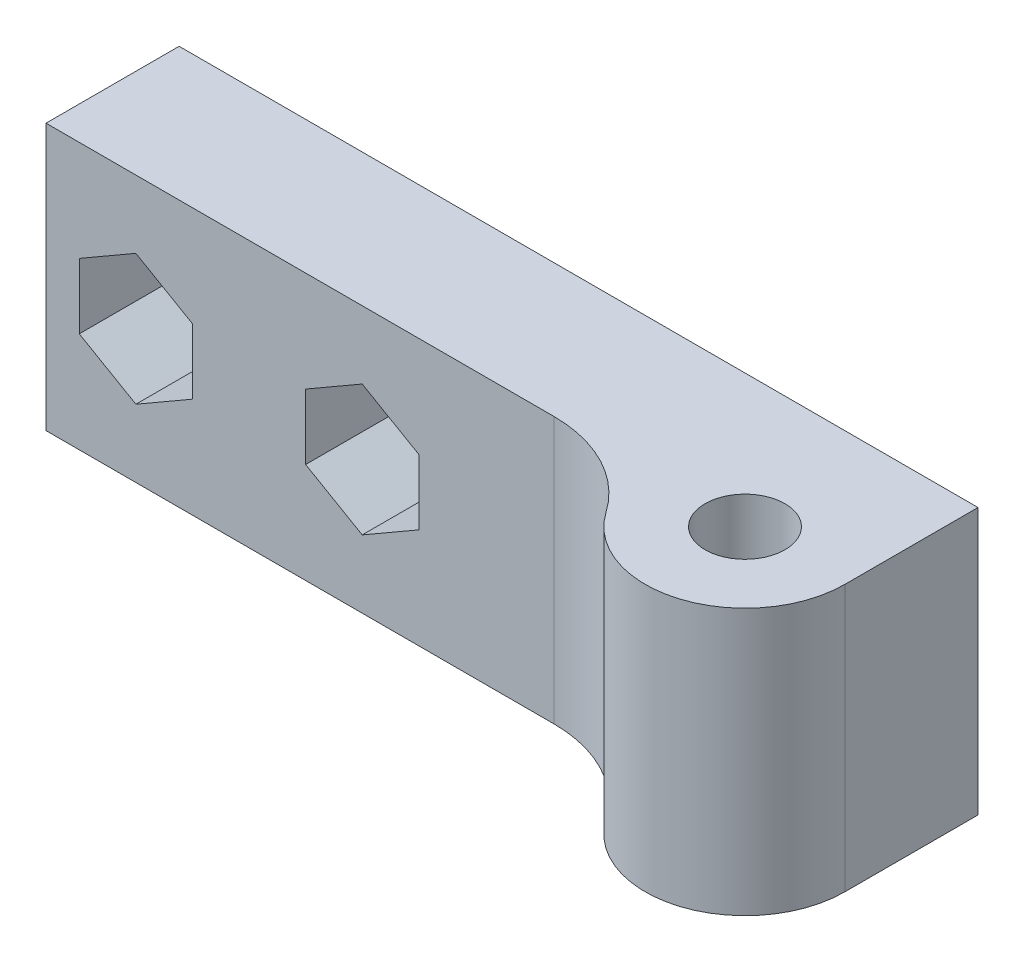
ISO-10303-21;
HEADER;
FILE_DESCRIPTION(('STEP AP214'),'2;1');
FILE_NAME('part.step','',(''),(''),'','','');
FILE_SCHEMA(('AUTOMOTIVE_DESIGN { 1 0 10303 214 1 1 1 1 }'));
ENDSEC;
DATA;
#1=APPLICATION_CONTEXT('core data for automotive mechanical design processes');
#2=APPLICATION_PROTOCOL_DEFINITION('international standard','automotive_design',2000,#1);
#3=PRODUCT_CONTEXT('',#1,'mechanical');
#4=PRODUCT('Part','Part','',(#3));
#5=PRODUCT_RELATED_PRODUCT_CATEGORY('part','',(#4));
#6=PRODUCT_DEFINITION_FORMATION('','',#4);
#7=PRODUCT_DEFINITION_CONTEXT('part definition',#1,'design');
#8=PRODUCT_DEFINITION('design','',#6,#7);
#9=PRODUCT_DEFINITION_SHAPE('','',#8);
#10=(LENGTH_UNIT() NAMED_UNIT(*) SI_UNIT(.MILLI.,.METRE.));
#11=(NAMED_UNIT(*) PLANE_ANGLE_UNIT() SI_UNIT($,.RADIAN.));
#12=(NAMED_UNIT(*) SI_UNIT($,.STERADIAN.) SOLID_ANGLE_UNIT());
#13=UNCERTAINTY_MEASURE_WITH_UNIT(LENGTH_MEASURE(1.E-05),#10,'distance_accuracy_value','');
#14=(GEOMETRIC_REPRESENTATION_CONTEXT(3) GLOBAL_UNCERTAINTY_ASSIGNED_CONTEXT((#13)) GLOBAL_UNIT_ASSIGNED_CONTEXT((#10,
#11,#12)) REPRESENTATION_CONTEXT('',''));
#15=CARTESIAN_POINT('',(0.,0.,0.));
#16=DIRECTION('',(0.,0.,1.));
#17=DIRECTION('',(1.,0.,0.));
#18=AXIS2_PLACEMENT_3D('',#15,#16,#17);
#19=CARTESIAN_POINT('',(-30.,0.,10.));
#20=DIRECTION('',(1.,0.,0.));
#21=DIRECTION('',(0.,1.,0.));
#22=AXIS2_PLACEMENT_3D('',#19,#20,#21);
#23=PLANE('',#22);
#24=DIRECTION('',(0.,-1.,0.));
#25=VECTOR('',#24,1.);
#26=CARTESIAN_POINT('',(-30.,0.,0.));
#27=LINE('',#26,#25);
#28=CARTESIAN_POINT('',(-30.,0.,0.));
#29=VERTEX_POINT('',#28);
#30=CARTESIAN_POINT('',(-30.,-20.,0.));
#31=VERTEX_POINT('',#30);
#32=EDGE_CURVE('E262',#29,#31,#27,.T.);
#33=ORIENTED_EDGE('',*,*,#32,.T.);
#34=DIRECTION('',(0.,0.,-1.));
#35=VECTOR('',#34,1.);
#36=CARTESIAN_POINT('',(-30.,-20.,10.));
#37=LINE('',#36,#35);
#38=CARTESIAN_POINT('',(-30.,-20.,10.));
#39=VERTEX_POINT('',#38);
#40=EDGE_CURVE('E300',#39,#31,#37,.T.);
#41=ORIENTED_EDGE('',*,*,#40,.F.);
#42=DIRECTION('',(0.,-1.,0.));
#43=VECTOR('',#42,1.);
#44=CARTESIAN_POINT('',(-30.,0.,10.));
#45=LINE('',#44,#43);
#46=CARTESIAN_POINT('',(-30.,0.,10.));
#47=VERTEX_POINT('',#46);
#48=EDGE_CURVE('E273',#47,#39,#45,.T.);
#49=ORIENTED_EDGE('',*,*,#48,.F.);
#50=DIRECTION('',(0.,0.,-1.));
#51=VECTOR('',#50,1.);
#52=CARTESIAN_POINT('',(-30.,0.,10.));
#53=LINE('',#52,#51);
#54=EDGE_CURVE('E284',#47,#29,#53,.T.);
#55=ORIENTED_EDGE('',*,*,#54,.T.);
#56=EDGE_LOOP('',(#33,#41,#49,#55));
#57=FACE_BOUND('',#56,.T.);
#58=ADVANCED_FACE('F33',(#57),#23,.F.);
#59=CARTESIAN_POINT('',(-30.,-20.,10.));
#60=DIRECTION('',(0.,1.,0.));
#61=DIRECTION('',(-1.,0.,0.));
#62=AXIS2_PLACEMENT_3D('',#59,#60,#61);
#63=PLANE('',#62);
#64=CARTESIAN_POINT('',(22.5,-20.,10.));
#65=DIRECTION('',(0.,1.,0.));
#66=DIRECTION('',(-1.,0.,0.));
#67=AXIS2_PLACEMENT_3D('',#64,#65,#66);
#68=CIRCLE('',#67,3.);
#69=CARTESIAN_POINT('',(19.5,-20.,10.));
#70=VERTEX_POINT('',#69);
#71=EDGE_CURVE('E319',#70,#70,#68,.T.);
#72=ORIENTED_EDGE('',*,*,#71,.T.);
#73=EDGE_LOOP('',(#72));
#74=FACE_BOUND('',#73,.T.);
#75=DIRECTION('',(0.,0.,-1.));
#76=VECTOR('',#75,1.);
#77=CARTESIAN_POINT('',(30.,-20.,10.));
#78=LINE('',#77,#76);
#79=CARTESIAN_POINT('',(30.,-20.,10.));
#80=VERTEX_POINT('',#79);
#81=CARTESIAN_POINT('',(30.,-20.,0.));
#82=VERTEX_POINT('',#81);
#83=EDGE_CURVE('E297',#80,#82,#78,.T.);
#84=ORIENTED_EDGE('',*,*,#83,.F.);
#85=CARTESIAN_POINT('',(22.5,-20.,10.));
#86=DIRECTION('',(0.,1.,0.));
#87=DIRECTION('',(-1.,0.,0.));
#88=AXIS2_PLACEMENT_3D('',#85,#86,#87);
#89=CIRCLE('',#88,7.5);
#90=CARTESIAN_POINT('',(16.3451114501378,-20.,14.2857142857143));
#91=VERTEX_POINT('',#90);
#92=EDGE_CURVE('E310',#91,#80,#89,.T.);
#93=ORIENTED_EDGE('',*,*,#92,.F.);
#94=CARTESIAN_POINT('',(8.13859338365493,-20.,20.));
#95=DIRECTION('',(0.,1.,0.));
#96=DIRECTION('',(-1.,0.,0.));
#97=AXIS2_PLACEMENT_3D('',#94,#95,#96);
#98=CIRCLE('',#97,10.);
#99=CARTESIAN_POINT('',(8.13859338365493,-20.,10.));
#100=VERTEX_POINT('',#99);
#101=EDGE_CURVE('E41',#91,#100,#98,.T.);
#102=ORIENTED_EDGE('',*,*,#101,.T.);
#103=DIRECTION('',(1.,0.,0.));
#104=VECTOR('',#103,1.);
#105=CARTESIAN_POINT('',(-30.,-20.,10.));
#106=LINE('',#105,#104);
#107=EDGE_CURVE('E276',#39,#100,#106,.T.);
#108=ORIENTED_EDGE('',*,*,#107,.F.);
#109=ORIENTED_EDGE('',*,*,#40,.T.);
#110=DIRECTION('',(1.,0.,0.));
#111=VECTOR('',#110,1.);
#112=CARTESIAN_POINT('',(-30.,-20.,0.));
#113=LINE('',#112,#111);
#114=EDGE_CURVE('E287',#31,#82,#113,.T.);
#115=ORIENTED_EDGE('',*,*,#114,.T.);
#116=EDGE_LOOP('',(#84,#93,#102,#108,#109,#115));
#117=FACE_BOUND('',#116,.T.);
#118=ADVANCED_FACE('F315',(#74,#117),#63,.F.);
#119=CARTESIAN_POINT('',(30.,0.,10.));
#120=DIRECTION('',(-1.,0.,0.));
#121=DIRECTION('',(0.,-1.,0.));
#122=AXIS2_PLACEMENT_3D('',#119,#120,#121);
#123=PLANE('',#122);
#124=DIRECTION('',(0.,1.,0.));
#125=VECTOR('',#124,1.);
#126=CARTESIAN_POINT('',(30.,0.,0.));
#127=LINE('',#126,#125);
#128=CARTESIAN_POINT('',(30.,0.,0.));
#129=VERTEX_POINT('',#128);
#130=EDGE_CURVE('E289',#82,#129,#127,.T.);
#131=ORIENTED_EDGE('',*,*,#130,.T.);
#132=DIRECTION('',(0.,0.,-1.));
#133=VECTOR('',#132,1.);
#134=CARTESIAN_POINT('',(30.,0.,10.));
#135=LINE('',#134,#133);
#136=CARTESIAN_POINT('',(30.,0.,10.));
#137=VERTEX_POINT('',#136);
#138=EDGE_CURVE('E294',#137,#129,#135,.T.);
#139=ORIENTED_EDGE('',*,*,#138,.F.);
#140=DIRECTION('',(0.,1.,0.));
#141=VECTOR('',#140,1.);
#142=CARTESIAN_POINT('',(30.,0.,10.));
#143=LINE('',#142,#141);
#144=EDGE_CURVE('E279',#80,#137,#143,.T.);
#145=ORIENTED_EDGE('',*,*,#144,.F.);
#146=ORIENTED_EDGE('',*,*,#83,.T.);
#147=EDGE_LOOP('',(#131,#139,#145,#146));
#148=FACE_BOUND('',#147,.T.);
#149=ADVANCED_FACE('F349',(#148),#123,.F.);
#150=CARTESIAN_POINT('',(-30.,0.,10.));
#151=DIRECTION('',(0.,-1.,0.));
#152=DIRECTION('',(1.,0.,0.));
#153=AXIS2_PLACEMENT_3D('',#150,#151,#152);
#154=PLANE('',#153);
#155=CARTESIAN_POINT('',(22.5,0.,10.));
#156=DIRECTION('',(0.,1.,0.));
#157=DIRECTION('',(-1.,0.,0.));
#158=AXIS2_PLACEMENT_3D('',#155,#156,#157);
#159=CIRCLE('',#158,3.);
#160=CARTESIAN_POINT('',(19.5,0.,10.));
#161=VERTEX_POINT('',#160);
#162=EDGE_CURVE('E322',#161,#161,#159,.T.);
#163=ORIENTED_EDGE('',*,*,#162,.F.);
#164=EDGE_LOOP('',(#163));
#165=FACE_BOUND('',#164,.T.);
#166=DIRECTION('',(-1.,0.,0.));
#167=VECTOR('',#166,1.);
#168=CARTESIAN_POINT('',(-30.,0.,10.));
#169=LINE('',#168,#167);
#170=CARTESIAN_POINT('',(8.13859338365493,0.,10.));
#171=VERTEX_POINT('',#170);
#172=EDGE_CURVE('E282',#171,#47,#169,.T.);
#173=ORIENTED_EDGE('',*,*,#172,.F.);
#174=CARTESIAN_POINT('',(8.13859338365493,0.,20.));
#175=DIRECTION('',(0.,-1.,0.));
#176=DIRECTION('',(1.,0.,0.));
#177=AXIS2_PLACEMENT_3D('',#174,#175,#176);
#178=CIRCLE('',#177,10.);
#179=CARTESIAN_POINT('',(16.3451114501378,0.,14.2857142857143));
#180=VERTEX_POINT('',#179);
#181=EDGE_CURVE('E11',#171,#180,#178,.T.);
#182=ORIENTED_EDGE('',*,*,#181,.T.);
#183=CARTESIAN_POINT('',(22.5,0.,10.));
#184=DIRECTION('',(0.,1.,0.));
#185=DIRECTION('',(-1.,0.,0.));
#186=AXIS2_PLACEMENT_3D('',#183,#184,#185);
#187=CIRCLE('',#186,7.5);
#188=EDGE_CURVE('E312',#180,#137,#187,.T.);
#189=ORIENTED_EDGE('',*,*,#188,.T.);
#190=ORIENTED_EDGE('',*,*,#138,.T.);
#191=DIRECTION('',(-1.,0.,0.));
#192=VECTOR('',#191,1.);
#193=CARTESIAN_POINT('',(-30.,0.,0.));
#194=LINE('',#193,#192);
#195=EDGE_CURVE('E277',#129,#29,#194,.T.);
#196=ORIENTED_EDGE('',*,*,#195,.T.);
#197=ORIENTED_EDGE('',*,*,#54,.F.);
#198=EDGE_LOOP('',(#173,#182,#189,#190,#196,#197));
#199=FACE_BOUND('',#198,.T.);
#200=ADVANCED_FACE('F355',(#165,#199),#154,.F.);
#201=CARTESIAN_POINT('',(0.,0.,10.));
#202=DIRECTION('',(0.,0.,1.));
#203=DIRECTION('',(1.,0.,0.));
#204=AXIS2_PLACEMENT_3D('',#201,#202,#203);
#205=PLANE('',#204);
#206=ORIENTED_EDGE('',*,*,#107,.T.);
#207=DIRECTION('',(0.,-1.,0.));
#208=VECTOR('',#207,1.);
#209=CARTESIAN_POINT('',(8.13859338365493,0.,10.));
#210=LINE('',#209,#208);
#211=EDGE_CURVE('E54',#100,#171,#210,.F.);
#212=ORIENTED_EDGE('',*,*,#211,.T.);
#213=ORIENTED_EDGE('',*,*,#172,.T.);
#214=ORIENTED_EDGE('',*,*,#48,.T.);
#215=EDGE_LOOP('',(#206,#212,#213,#214));
#216=FACE_BOUND('',#215,.T.);
#217=DIRECTION('',(0.866025403784439,-0.5,0.));
#218=VECTOR('',#217,1.);
#219=CARTESIAN_POINT('',(-10.5,-12.4537386440559,10.));
#220=LINE('',#219,#218);
#221=CARTESIAN_POINT('',(-10.5,-12.4537386440559,10.));
#222=VERTEX_POINT('',#221);
#223=CARTESIAN_POINT('',(-6.24999999999998,-14.9074772881118,10.));
#224=VERTEX_POINT('',#223);
#225=EDGE_CURVE('E163',#222,#224,#220,.T.);
#226=ORIENTED_EDGE('',*,*,#225,.F.);
#227=DIRECTION('',(0.,-1.,0.));
#228=VECTOR('',#227,1.);
#229=CARTESIAN_POINT('',(-10.5,-7.54626135594409,10.));
#230=LINE('',#229,#228);
#231=CARTESIAN_POINT('',(-10.5,-7.54626135594409,10.));
#232=VERTEX_POINT('',#231);
#233=EDGE_CURVE('E181',#232,#222,#230,.T.);
#234=ORIENTED_EDGE('',*,*,#233,.F.);
#235=DIRECTION('',(-0.866025403784439,-0.5,0.));
#236=VECTOR('',#235,1.);
#237=CARTESIAN_POINT('',(-6.24999999999998,-5.09252271188818,10.));
#238=LINE('',#237,#236);
#239=CARTESIAN_POINT('',(-6.24999999999998,-5.09252271188818,10.));
#240=VERTEX_POINT('',#239);
#241=EDGE_CURVE('E184',#240,#232,#238,.T.);
#242=ORIENTED_EDGE('',*,*,#241,.F.);
#243=DIRECTION('',(-0.866025403784438,0.500000000000001,0.));
#244=VECTOR('',#243,1.);
#245=CARTESIAN_POINT('',(-1.99999999999998,-7.54626135594409,10.));
#246=LINE('',#245,#244);
#247=CARTESIAN_POINT('',(-1.99999999999998,-7.54626135594409,10.));
#248=VERTEX_POINT('',#247);
#249=EDGE_CURVE('E204',#248,#240,#246,.T.);
#250=ORIENTED_EDGE('',*,*,#249,.F.);
#251=DIRECTION('',(0.,1.,0.));
#252=VECTOR('',#251,1.);
#253=CARTESIAN_POINT('',(-1.99999999999998,-12.4537386440559,10.));
#254=LINE('',#253,#252);
#255=CARTESIAN_POINT('',(-1.99999999999998,-12.4537386440559,10.));
#256=VERTEX_POINT('',#255);
#257=EDGE_CURVE('E201',#256,#248,#254,.T.);
#258=ORIENTED_EDGE('',*,*,#257,.F.);
#259=DIRECTION('',(0.866025403784439,0.5,0.));
#260=VECTOR('',#259,1.);
#261=CARTESIAN_POINT('',(-6.24999999999998,-14.9074772881118,10.));
#262=LINE('',#261,#260);
#263=EDGE_CURVE('E198',#224,#256,#262,.T.);
#264=ORIENTED_EDGE('',*,*,#263,.F.);
#265=EDGE_LOOP('',(#226,#234,#242,#250,#258,#264));
#266=FACE_BOUND('',#265,.T.);
#267=DIRECTION('',(0.866025403784439,-0.5,0.));
#268=VECTOR('',#267,1.);
#269=CARTESIAN_POINT('',(-27.5,-12.4537386440559,10.));
#270=LINE('',#269,#268);
#271=CARTESIAN_POINT('',(-27.5,-12.4537386440559,10.));
#272=VERTEX_POINT('',#271);
#273=CARTESIAN_POINT('',(-23.25,-14.9074772881118,10.));
#274=VERTEX_POINT('',#273);
#275=EDGE_CURVE('E222',#272,#274,#270,.T.);
#276=ORIENTED_EDGE('',*,*,#275,.F.);
#277=DIRECTION('',(0.,-1.,0.));
#278=VECTOR('',#277,1.);
#279=CARTESIAN_POINT('',(-27.5,-7.54626135594409,10.));
#280=LINE('',#279,#278);
#281=CARTESIAN_POINT('',(-27.5,-7.54626135594409,10.));
#282=VERTEX_POINT('',#281);
#283=EDGE_CURVE('E229',#282,#272,#280,.T.);
#284=ORIENTED_EDGE('',*,*,#283,.F.);
#285=DIRECTION('',(-0.866025403784439,-0.5,0.));
#286=VECTOR('',#285,1.);
#287=CARTESIAN_POINT('',(-23.25,-5.09252271188818,10.));
#288=LINE('',#287,#286);
#289=CARTESIAN_POINT('',(-23.25,-5.09252271188818,10.));
#290=VERTEX_POINT('',#289);
#291=EDGE_CURVE('E255',#290,#282,#288,.T.);
#292=ORIENTED_EDGE('',*,*,#291,.F.);
#293=DIRECTION('',(-0.866025403784438,0.500000000000001,0.));
#294=VECTOR('',#293,1.);
#295=CARTESIAN_POINT('',(-19.,-7.54626135594409,10.));
#296=LINE('',#295,#294);
#297=CARTESIAN_POINT('',(-19.,-7.54626135594409,10.));
#298=VERTEX_POINT('',#297);
#299=EDGE_CURVE('E252',#298,#290,#296,.T.);
#300=ORIENTED_EDGE('',*,*,#299,.F.);
#301=DIRECTION('',(0.,1.,0.));
#302=VECTOR('',#301,1.);
#303=CARTESIAN_POINT('',(-19.,-12.4537386440559,10.));
#304=LINE('',#303,#302);
#305=CARTESIAN_POINT('',(-19.,-12.4537386440559,10.));
#306=VERTEX_POINT('',#305);
#307=EDGE_CURVE('E249',#306,#298,#304,.T.);
#308=ORIENTED_EDGE('',*,*,#307,.F.);
#309=DIRECTION('',(0.866025403784439,0.5,0.));
#310=VECTOR('',#309,1.);
#311=CARTESIAN_POINT('',(-23.25,-14.9074772881118,10.));
#312=LINE('',#311,#310);
#313=EDGE_CURVE('E246',#274,#306,#312,.T.);
#314=ORIENTED_EDGE('',*,*,#313,.F.);
#315=EDGE_LOOP('',(#276,#284,#292,#300,#308,#314));
#316=FACE_BOUND('',#315,.T.);
#317=ADVANCED_FACE('F359',(#216,#266,#316),#205,.T.);
#318=CARTESIAN_POINT('',(0.,0.,0.));
#319=DIRECTION('',(0.,0.,1.));
#320=DIRECTION('',(1.,0.,0.));
#321=AXIS2_PLACEMENT_3D('',#318,#319,#320);
#322=PLANE('',#321);
#323=CARTESIAN_POINT('',(-6.24999999999998,-10.,0.));
#324=DIRECTION('',(0.,0.,1.));
#325=DIRECTION('',(1.,0.,0.));
#326=AXIS2_PLACEMENT_3D('',#323,#324,#325);
#327=CIRCLE('',#326,2.75);
#328=CARTESIAN_POINT('',(-3.49999999999998,-10.,0.));
#329=VERTEX_POINT('',#328);
#330=EDGE_CURVE('E199',#329,#329,#327,.T.);
#331=ORIENTED_EDGE('',*,*,#330,.T.);
#332=EDGE_LOOP('',(#331));
#333=FACE_BOUND('',#332,.T.);
#334=CARTESIAN_POINT('',(-23.25,-10.,0.));
#335=DIRECTION('',(0.,0.,1.));
#336=DIRECTION('',(1.,0.,0.));
#337=AXIS2_PLACEMENT_3D('',#334,#335,#336);
#338=CIRCLE('',#337,2.75);
#339=CARTESIAN_POINT('',(-20.5,-10.,0.));
#340=VERTEX_POINT('',#339);
#341=EDGE_CURVE('E219',#340,#340,#338,.T.);
#342=ORIENTED_EDGE('',*,*,#341,.T.);
#343=EDGE_LOOP('',(#342));
#344=FACE_BOUND('',#343,.T.);
#345=ORIENTED_EDGE('',*,*,#32,.F.);
#346=ORIENTED_EDGE('',*,*,#195,.F.);
#347=ORIENTED_EDGE('',*,*,#130,.F.);
#348=ORIENTED_EDGE('',*,*,#114,.F.);
#349=EDGE_LOOP('',(#345,#346,#347,#348));
#350=FACE_BOUND('',#349,.T.);
#351=ADVANCED_FACE('F327',(#333,#344,#350),#322,.F.);
#352=CARTESIAN_POINT('',(-27.5,-12.4537386440559,2.5));
#353=DIRECTION('',(-0.5,-0.866025403784439,0.));
#354=DIRECTION('',(0.866025403784439,-0.5,0.));
#355=AXIS2_PLACEMENT_3D('',#352,#353,#354);
#356=PLANE('',#355);
#357=ORIENTED_EDGE('',*,*,#275,.T.);
#358=DIRECTION('',(0.,0.,1.));
#359=VECTOR('',#358,1.);
#360=CARTESIAN_POINT('',(-23.25,-14.9074772881118,2.5));
#361=LINE('',#360,#359);
#362=CARTESIAN_POINT('',(-23.25,-14.9074772881118,2.5));
#363=VERTEX_POINT('',#362);
#364=EDGE_CURVE('E244',#363,#274,#361,.T.);
#365=ORIENTED_EDGE('',*,*,#364,.F.);
#366=DIRECTION('',(0.866025403784439,-0.5,0.));
#367=VECTOR('',#366,1.);
#368=CARTESIAN_POINT('',(-27.5,-12.4537386440559,2.5));
#369=LINE('',#368,#367);
#370=CARTESIAN_POINT('',(-27.5,-12.4537386440559,2.5));
#371=VERTEX_POINT('',#370);
#372=EDGE_CURVE('E225',#371,#363,#369,.T.);
#373=ORIENTED_EDGE('',*,*,#372,.F.);
#374=DIRECTION('',(0.,0.,1.));
#375=VECTOR('',#374,1.);
#376=CARTESIAN_POINT('',(-27.5,-12.4537386440559,2.5));
#377=LINE('',#376,#375);
#378=EDGE_CURVE('E260',#371,#272,#377,.T.);
#379=ORIENTED_EDGE('',*,*,#378,.T.);
#380=EDGE_LOOP('',(#357,#365,#373,#379));
#381=FACE_BOUND('',#380,.T.);
#382=ADVANCED_FACE('F363',(#381),#356,.F.);
#383=CARTESIAN_POINT('',(-27.5,-7.54626135594409,2.5));
#384=DIRECTION('',(-1.,0.,0.));
#385=DIRECTION('',(0.,0.,1.));
#386=AXIS2_PLACEMENT_3D('',#383,#384,#385);
#387=PLANE('',#386);
#388=ORIENTED_EDGE('',*,*,#283,.T.);
#389=ORIENTED_EDGE('',*,*,#378,.F.);
#390=DIRECTION('',(0.,-1.,0.));
#391=VECTOR('',#390,1.);
#392=CARTESIAN_POINT('',(-27.5,-7.54626135594409,2.5));
#393=LINE('',#392,#391);
#394=CARTESIAN_POINT('',(-27.5,-7.54626135594409,2.5));
#395=VERTEX_POINT('',#394);
#396=EDGE_CURVE('E241',#395,#371,#393,.T.);
#397=ORIENTED_EDGE('',*,*,#396,.F.);
#398=DIRECTION('',(0.,0.,1.));
#399=VECTOR('',#398,1.);
#400=CARTESIAN_POINT('',(-27.5,-7.54626135594409,2.5));
#401=LINE('',#400,#399);
#402=EDGE_CURVE('E263',#395,#282,#401,.T.);
#403=ORIENTED_EDGE('',*,*,#402,.T.);
#404=EDGE_LOOP('',(#388,#389,#397,#403));
#405=FACE_BOUND('',#404,.T.);
#406=ADVANCED_FACE('F368',(#405),#387,.F.);
#407=CARTESIAN_POINT('',(-23.25,-5.09252271188818,2.5));
#408=DIRECTION('',(-0.5,0.866025403784439,0.));
#409=DIRECTION('',(-0.866025403784439,-0.5,0.));
#410=AXIS2_PLACEMENT_3D('',#407,#408,#409);
#411=PLANE('',#410);
#412=ORIENTED_EDGE('',*,*,#291,.T.);
#413=ORIENTED_EDGE('',*,*,#402,.F.);
#414=DIRECTION('',(-0.866025403784439,-0.5,0.));
#415=VECTOR('',#414,1.);
#416=CARTESIAN_POINT('',(-23.25,-5.09252271188818,2.5));
#417=LINE('',#416,#415);
#418=CARTESIAN_POINT('',(-23.25,-5.09252271188818,2.5));
#419=VERTEX_POINT('',#418);
#420=EDGE_CURVE('E238',#419,#395,#417,.T.);
#421=ORIENTED_EDGE('',*,*,#420,.F.);
#422=DIRECTION('',(0.,0.,1.));
#423=VECTOR('',#422,1.);
#424=CARTESIAN_POINT('',(-23.25,-5.09252271188818,2.5));
#425=LINE('',#424,#423);
#426=EDGE_CURVE('E265',#419,#290,#425,.T.);
#427=ORIENTED_EDGE('',*,*,#426,.T.);
#428=EDGE_LOOP('',(#412,#413,#421,#427));
#429=FACE_BOUND('',#428,.T.);
#430=ADVANCED_FACE('F382',(#429),#411,.F.);
#431=CARTESIAN_POINT('',(-19.,-7.54626135594409,2.5));
#432=DIRECTION('',(0.500000000000001,0.866025403784438,0.));
#433=DIRECTION('',(-0.866025403784438,0.500000000000001,0.));
#434=AXIS2_PLACEMENT_3D('',#431,#432,#433);
#435=PLANE('',#434);
#436=ORIENTED_EDGE('',*,*,#299,.T.);
#437=ORIENTED_EDGE('',*,*,#426,.F.);
#438=DIRECTION('',(-0.866025403784438,0.500000000000001,0.));
#439=VECTOR('',#438,1.);
#440=CARTESIAN_POINT('',(-19.,-7.54626135594409,2.5));
#441=LINE('',#440,#439);
#442=CARTESIAN_POINT('',(-19.,-7.54626135594409,2.5));
#443=VERTEX_POINT('',#442);
#444=EDGE_CURVE('E235',#443,#419,#441,.T.);
#445=ORIENTED_EDGE('',*,*,#444,.F.);
#446=DIRECTION('',(0.,0.,1.));
#447=VECTOR('',#446,1.);
#448=CARTESIAN_POINT('',(-19.,-7.54626135594409,2.5));
#449=LINE('',#448,#447);
#450=EDGE_CURVE('E267',#443,#298,#449,.T.);
#451=ORIENTED_EDGE('',*,*,#450,.T.);
#452=EDGE_LOOP('',(#436,#437,#445,#451));
#453=FACE_BOUND('',#452,.T.);
#454=ADVANCED_FACE('F378',(#453),#435,.F.);
#455=CARTESIAN_POINT('',(-19.,-12.4537386440559,2.5));
#456=DIRECTION('',(1.,0.,0.));
#457=DIRECTION('',(0.,0.,-1.));
#458=AXIS2_PLACEMENT_3D('',#455,#456,#457);
#459=PLANE('',#458);
#460=ORIENTED_EDGE('',*,*,#307,.T.);
#461=ORIENTED_EDGE('',*,*,#450,.F.);
#462=DIRECTION('',(0.,1.,0.));
#463=VECTOR('',#462,1.);
#464=CARTESIAN_POINT('',(-19.,-12.4537386440559,2.5));
#465=LINE('',#464,#463);
#466=CARTESIAN_POINT('',(-19.,-12.4537386440559,2.5));
#467=VERTEX_POINT('',#466);
#468=EDGE_CURVE('E232',#467,#443,#465,.T.);
#469=ORIENTED_EDGE('',*,*,#468,.F.);
#470=DIRECTION('',(0.,0.,1.));
#471=VECTOR('',#470,1.);
#472=CARTESIAN_POINT('',(-19.,-12.4537386440559,2.5));
#473=LINE('',#472,#471);
#474=EDGE_CURVE('E269',#467,#306,#473,.T.);
#475=ORIENTED_EDGE('',*,*,#474,.T.);
#476=EDGE_LOOP('',(#460,#461,#469,#475));
#477=FACE_BOUND('',#476,.T.);
#478=ADVANCED_FACE('F374',(#477),#459,.F.);
#479=CARTESIAN_POINT('',(-23.25,-14.9074772881118,2.5));
#480=DIRECTION('',(0.5,-0.866025403784438,0.));
#481=DIRECTION('',(0.866025403784439,0.5,0.));
#482=AXIS2_PLACEMENT_3D('',#479,#480,#481);
#483=PLANE('',#482);
#484=ORIENTED_EDGE('',*,*,#313,.T.);
#485=ORIENTED_EDGE('',*,*,#474,.F.);
#486=DIRECTION('',(0.866025403784439,0.5,0.));
#487=VECTOR('',#486,1.);
#488=CARTESIAN_POINT('',(-23.25,-14.9074772881118,2.5));
#489=LINE('',#488,#487);
#490=EDGE_CURVE('E228',#363,#467,#489,.T.);
#491=ORIENTED_EDGE('',*,*,#490,.F.);
#492=ORIENTED_EDGE('',*,*,#364,.T.);
#493=EDGE_LOOP('',(#484,#485,#491,#492));
#494=FACE_BOUND('',#493,.T.);
#495=ADVANCED_FACE('F370',(#494),#483,.F.);
#496=CARTESIAN_POINT('',(0.,0.,2.5));
#497=DIRECTION('',(0.,0.,1.));
#498=DIRECTION('',(1.,0.,0.));
#499=AXIS2_PLACEMENT_3D('',#496,#497,#498);
#500=PLANE('',#499);
#501=CARTESIAN_POINT('',(-23.25,-10.,2.5));
#502=DIRECTION('',(0.,0.,1.));
#503=DIRECTION('',(1.,0.,0.));
#504=AXIS2_PLACEMENT_3D('',#501,#502,#503);
#505=CIRCLE('',#504,2.75);
#506=CARTESIAN_POINT('',(-20.5,-10.,2.5));
#507=VERTEX_POINT('',#506);
#508=EDGE_CURVE('E211',#507,#507,#505,.T.);
#509=ORIENTED_EDGE('',*,*,#508,.F.);
#510=EDGE_LOOP('',(#509));
#511=FACE_BOUND('',#510,.T.);
#512=ORIENTED_EDGE('',*,*,#372,.T.);
#513=ORIENTED_EDGE('',*,*,#490,.T.);
#514=ORIENTED_EDGE('',*,*,#468,.T.);
#515=ORIENTED_EDGE('',*,*,#444,.T.);
#516=ORIENTED_EDGE('',*,*,#420,.T.);
#517=ORIENTED_EDGE('',*,*,#396,.T.);
#518=EDGE_LOOP('',(#512,#513,#514,#515,#516,#517));
#519=FACE_BOUND('',#518,.T.);
#520=ADVANCED_FACE('F373',(#511,#519),#500,.T.);
#521=CARTESIAN_POINT('',(-23.25,-10.,0.));
#522=DIRECTION('',(0.,0.,1.));
#523=DIRECTION('',(1.,0.,0.));
#524=AXIS2_PLACEMENT_3D('',#521,#522,#523);
#525=CYLINDRICAL_SURFACE('',#524,2.75);
#526=ORIENTED_EDGE('',*,*,#341,.F.);
#527=EDGE_LOOP('',(#526));
#528=FACE_BOUND('',#527,.T.);
#529=ORIENTED_EDGE('',*,*,#508,.T.);
#530=EDGE_LOOP('',(#529));
#531=FACE_BOUND('',#530,.T.);
#532=ADVANCED_FACE('F392',(#528,#531),#525,.F.);
#533=CARTESIAN_POINT('',(-10.5,-12.4537386440559,2.5));
#534=DIRECTION('',(-0.5,-0.866025403784439,0.));
#535=DIRECTION('',(0.866025403784439,-0.5,0.));
#536=AXIS2_PLACEMENT_3D('',#533,#534,#535);
#537=PLANE('',#536);
#538=ORIENTED_EDGE('',*,*,#225,.T.);
#539=DIRECTION('',(0.,0.,1.));
#540=VECTOR('',#539,1.);
#541=CARTESIAN_POINT('',(-6.24999999999998,-14.9074772881118,2.5));
#542=LINE('',#541,#540);
#543=CARTESIAN_POINT('',(-6.24999999999998,-14.9074772881118,2.5));
#544=VERTEX_POINT('',#543);
#545=EDGE_CURVE('E156',#544,#224,#542,.T.);
#546=ORIENTED_EDGE('',*,*,#545,.F.);
#547=DIRECTION('',(0.866025403784439,-0.5,0.));
#548=VECTOR('',#547,1.);
#549=CARTESIAN_POINT('',(-10.5,-12.4537386440559,2.5));
#550=LINE('',#549,#548);
#551=CARTESIAN_POINT('',(-10.5,-12.4537386440559,2.5));
#552=VERTEX_POINT('',#551);
#553=EDGE_CURVE('E160',#552,#544,#550,.T.);
#554=ORIENTED_EDGE('',*,*,#553,.F.);
#555=DIRECTION('',(0.,0.,1.));
#556=VECTOR('',#555,1.);
#557=CARTESIAN_POINT('',(-10.5,-12.4537386440559,2.5));
#558=LINE('',#557,#556);
#559=EDGE_CURVE('E209',#552,#222,#558,.T.);
#560=ORIENTED_EDGE('',*,*,#559,.T.);
#561=EDGE_LOOP('',(#538,#546,#554,#560));
#562=FACE_BOUND('',#561,.T.);
#563=ADVANCED_FACE('F158',(#562),#537,.F.);
#564=CARTESIAN_POINT('',(-10.5,-7.54626135594409,2.5));
#565=DIRECTION('',(-1.,0.,0.));
#566=DIRECTION('',(0.,0.,1.));
#567=AXIS2_PLACEMENT_3D('',#564,#565,#566);
#568=PLANE('',#567);
#569=ORIENTED_EDGE('',*,*,#233,.T.);
#570=ORIENTED_EDGE('',*,*,#559,.F.);
#571=DIRECTION('',(0.,-1.,0.));
#572=VECTOR('',#571,1.);
#573=CARTESIAN_POINT('',(-10.5,-7.54626135594409,2.5));
#574=LINE('',#573,#572);
#575=CARTESIAN_POINT('',(-10.5,-7.54626135594409,2.5));
#576=VERTEX_POINT('',#575);
#577=EDGE_CURVE('E168',#576,#552,#574,.T.);
#578=ORIENTED_EDGE('',*,*,#577,.F.);
#579=DIRECTION('',(0.,0.,1.));
#580=VECTOR('',#579,1.);
#581=CARTESIAN_POINT('',(-10.5,-7.54626135594409,2.5));
#582=LINE('',#581,#580);
#583=EDGE_CURVE('E212',#576,#232,#582,.T.);
#584=ORIENTED_EDGE('',*,*,#583,.T.);
#585=EDGE_LOOP('',(#569,#570,#578,#584));
#586=FACE_BOUND('',#585,.T.);
#587=ADVANCED_FACE('F398',(#586),#568,.F.);
#588=CARTESIAN_POINT('',(-6.24999999999998,-5.09252271188818,2.5));
#589=DIRECTION('',(-0.5,0.866025403784439,0.));
#590=DIRECTION('',(-0.866025403784439,-0.5,0.));
#591=AXIS2_PLACEMENT_3D('',#588,#589,#590);
#592=PLANE('',#591);
#593=ORIENTED_EDGE('',*,*,#241,.T.);
#594=ORIENTED_EDGE('',*,*,#583,.F.);
#595=DIRECTION('',(-0.866025403784439,-0.5,0.));
#596=VECTOR('',#595,1.);
#597=CARTESIAN_POINT('',(-6.24999999999998,-5.09252271188818,2.5));
#598=LINE('',#597,#596);
#599=CARTESIAN_POINT('',(-6.24999999999998,-5.09252271188818,2.5));
#600=VERTEX_POINT('',#599);
#601=EDGE_CURVE('E194',#600,#576,#598,.T.);
#602=ORIENTED_EDGE('',*,*,#601,.F.);
#603=DIRECTION('',(0.,0.,1.));
#604=VECTOR('',#603,1.);
#605=CARTESIAN_POINT('',(-6.24999999999998,-5.09252271188818,2.5));
#606=LINE('',#605,#604);
#607=EDGE_CURVE('E214',#600,#240,#606,.T.);
#608=ORIENTED_EDGE('',*,*,#607,.T.);
#609=EDGE_LOOP('',(#593,#594,#602,#608));
#610=FACE_BOUND('',#609,.T.);
#611=ADVANCED_FACE('F406',(#610),#592,.F.);
#612=CARTESIAN_POINT('',(-1.99999999999998,-7.54626135594409,2.5));
#613=DIRECTION('',(0.500000000000001,0.866025403784438,0.));
#614=DIRECTION('',(-0.866025403784438,0.500000000000001,0.));
#615=AXIS2_PLACEMENT_3D('',#612,#613,#614);
#616=PLANE('',#615);
#617=ORIENTED_EDGE('',*,*,#249,.T.);
#618=ORIENTED_EDGE('',*,*,#607,.F.);
#619=DIRECTION('',(-0.866025403784438,0.500000000000001,0.));
#620=VECTOR('',#619,1.);
#621=CARTESIAN_POINT('',(-1.99999999999998,-7.54626135594409,2.5));
#622=LINE('',#621,#620);
#623=CARTESIAN_POINT('',(-1.99999999999998,-7.54626135594409,2.5));
#624=VERTEX_POINT('',#623);
#625=EDGE_CURVE('E191',#624,#600,#622,.T.);
#626=ORIENTED_EDGE('',*,*,#625,.F.);
#627=DIRECTION('',(0.,0.,1.));
#628=VECTOR('',#627,1.);
#629=CARTESIAN_POINT('',(-1.99999999999998,-7.54626135594409,2.5));
#630=LINE('',#629,#628);
#631=EDGE_CURVE('E216',#624,#248,#630,.T.);
#632=ORIENTED_EDGE('',*,*,#631,.T.);
#633=EDGE_LOOP('',(#617,#618,#626,#632));
#634=FACE_BOUND('',#633,.T.);
#635=ADVANCED_FACE('F402',(#634),#616,.F.);
#636=CARTESIAN_POINT('',(-1.99999999999998,-12.4537386440559,2.5));
#637=DIRECTION('',(1.,0.,0.));
#638=DIRECTION('',(0.,0.,-1.));
#639=AXIS2_PLACEMENT_3D('',#636,#637,#638);
#640=PLANE('',#639);
#641=ORIENTED_EDGE('',*,*,#257,.T.);
#642=ORIENTED_EDGE('',*,*,#631,.F.);
#643=DIRECTION('',(0.,1.,0.));
#644=VECTOR('',#643,1.);
#645=CARTESIAN_POINT('',(-1.99999999999998,-12.4537386440559,2.5));
#646=LINE('',#645,#644);
#647=CARTESIAN_POINT('',(-1.99999999999998,-12.4537386440559,2.5));
#648=VERTEX_POINT('',#647);
#649=EDGE_CURVE('E176',#648,#624,#646,.T.);
#650=ORIENTED_EDGE('',*,*,#649,.F.);
#651=DIRECTION('',(0.,0.,1.));
#652=VECTOR('',#651,1.);
#653=CARTESIAN_POINT('',(-1.99999999999998,-12.4537386440559,2.5));
#654=LINE('',#653,#652);
#655=EDGE_CURVE('E167',#648,#256,#654,.T.);
#656=ORIENTED_EDGE('',*,*,#655,.T.);
#657=EDGE_LOOP('',(#641,#642,#650,#656));
#658=FACE_BOUND('',#657,.T.);
#659=ADVANCED_FACE('F341',(#658),#640,.F.);
#660=CARTESIAN_POINT('',(-6.24999999999998,-14.9074772881118,2.5));
#661=DIRECTION('',(0.5,-0.866025403784438,0.));
#662=DIRECTION('',(0.866025403784439,0.5,0.));
#663=AXIS2_PLACEMENT_3D('',#660,#661,#662);
#664=PLANE('',#663);
#665=ORIENTED_EDGE('',*,*,#263,.T.);
#666=ORIENTED_EDGE('',*,*,#655,.F.);
#667=DIRECTION('',(0.866025403784439,0.5,0.));
#668=VECTOR('',#667,1.);
#669=CARTESIAN_POINT('',(-6.24999999999998,-14.9074772881118,2.5));
#670=LINE('',#669,#668);
#671=EDGE_CURVE('E171',#544,#648,#670,.T.);
#672=ORIENTED_EDGE('',*,*,#671,.F.);
#673=ORIENTED_EDGE('',*,*,#545,.T.);
#674=EDGE_LOOP('',(#665,#666,#672,#673));
#675=FACE_BOUND('',#674,.T.);
#676=ADVANCED_FACE('F172',(#675),#664,.F.);
#677=CARTESIAN_POINT('',(17.,0.,2.5));
#678=DIRECTION('',(0.,0.,1.));
#679=DIRECTION('',(1.,0.,0.));
#680=AXIS2_PLACEMENT_3D('',#677,#678,#679);
#681=PLANE('',#680);
#682=CARTESIAN_POINT('',(-6.24999999999998,-10.,2.5));
#683=DIRECTION('',(0.,0.,1.));
#684=DIRECTION('',(1.,0.,0.));
#685=AXIS2_PLACEMENT_3D('',#682,#683,#684);
#686=CIRCLE('',#685,2.75);
#687=CARTESIAN_POINT('',(-3.49999999999998,-10.,2.5));
#688=VERTEX_POINT('',#687);
#689=EDGE_CURVE('E187',#688,#688,#686,.T.);
#690=ORIENTED_EDGE('',*,*,#689,.F.);
#691=EDGE_LOOP('',(#690));
#692=FACE_BOUND('',#691,.T.);
#693=ORIENTED_EDGE('',*,*,#553,.T.);
#694=ORIENTED_EDGE('',*,*,#671,.T.);
#695=ORIENTED_EDGE('',*,*,#649,.T.);
#696=ORIENTED_EDGE('',*,*,#625,.T.);
#697=ORIENTED_EDGE('',*,*,#601,.T.);
#698=ORIENTED_EDGE('',*,*,#577,.T.);
#699=EDGE_LOOP('',(#693,#694,#695,#696,#697,#698));
#700=FACE_BOUND('',#699,.T.);
#701=ADVANCED_FACE('F178',(#692,#700),#681,.T.);
#702=CARTESIAN_POINT('',(-6.24999999999998,-10.,0.));
#703=DIRECTION('',(0.,0.,1.));
#704=DIRECTION('',(1.,0.,0.));
#705=AXIS2_PLACEMENT_3D('',#702,#703,#704);
#706=CYLINDRICAL_SURFACE('',#705,2.75);
#707=ORIENTED_EDGE('',*,*,#330,.F.);
#708=EDGE_LOOP('',(#707));
#709=FACE_BOUND('',#708,.T.);
#710=ORIENTED_EDGE('',*,*,#689,.T.);
#711=EDGE_LOOP('',(#710));
#712=FACE_BOUND('',#711,.T.);
#713=ADVANCED_FACE('F330',(#709,#712),#706,.F.);
#714=CARTESIAN_POINT('',(22.5,-20.,10.));
#715=DIRECTION('',(0.,1.,0.));
#716=DIRECTION('',(-1.,0.,0.));
#717=AXIS2_PLACEMENT_3D('',#714,#715,#716);
#718=CYLINDRICAL_SURFACE('',#717,7.5);
#719=ORIENTED_EDGE('',*,*,#188,.F.);
#720=DIRECTION('',(0.,1.,0.));
#721=VECTOR('',#720,1.);
#722=CARTESIAN_POINT('',(16.3451114501378,-20.,14.2857142857143));
#723=LINE('',#722,#721);
#724=EDGE_CURVE('E303',#180,#91,#723,.F.);
#725=ORIENTED_EDGE('',*,*,#724,.T.);
#726=ORIENTED_EDGE('',*,*,#92,.T.);
#727=ORIENTED_EDGE('',*,*,#144,.T.);
#728=EDGE_LOOP('',(#719,#725,#726,#727));
#729=FACE_BOUND('',#728,.T.);
#730=ADVANCED_FACE('F309',(#729),#718,.T.);
#731=CARTESIAN_POINT('',(22.5,-20.,10.));
#732=DIRECTION('',(0.,1.,0.));
#733=DIRECTION('',(-1.,0.,0.));
#734=AXIS2_PLACEMENT_3D('',#731,#732,#733);
#735=CYLINDRICAL_SURFACE('',#734,3.);
#736=ORIENTED_EDGE('',*,*,#71,.F.);
#737=EDGE_LOOP('',(#736));
#738=FACE_BOUND('',#737,.T.);
#739=ORIENTED_EDGE('',*,*,#162,.T.);
#740=EDGE_LOOP('',(#739));
#741=FACE_BOUND('',#740,.T.);
#742=ADVANCED_FACE('F478',(#738,#741),#735,.F.);
#743=CARTESIAN_POINT('',(8.13859338365493,-20.,20.));
#744=DIRECTION('',(0.,1.,0.));
#745=DIRECTION('',(-1.,0.,0.));
#746=AXIS2_PLACEMENT_3D('',#743,#744,#745);
#747=CYLINDRICAL_SURFACE('',#746,10.);
#748=ORIENTED_EDGE('',*,*,#181,.F.);
#749=ORIENTED_EDGE('',*,*,#211,.F.);
#750=ORIENTED_EDGE('',*,*,#101,.F.);
#751=ORIENTED_EDGE('',*,*,#724,.F.);
#752=EDGE_LOOP('',(#748,#749,#750,#751));
#753=FACE_BOUND('',#752,.T.);
#754=ADVANCED_FACE('F35',(#753),#747,.F.);
#755=CLOSED_SHELL('',(#58,#118,#149,#200,#317,#351,#382,#406,#430,#454,#478,#495,#520,#532,#563,
#587,#611,#635,#659,#676,#701,#713,#730,#742,#754));
#756=MANIFOLD_SOLID_BREP('B2',#755);
#757=ADVANCED_BREP_SHAPE_REPRESENTATION('',(#18,#756),#14);
#758=SHAPE_DEFINITION_REPRESENTATION(#9,#757);
ENDSEC;
END-ISO-10303-21;
